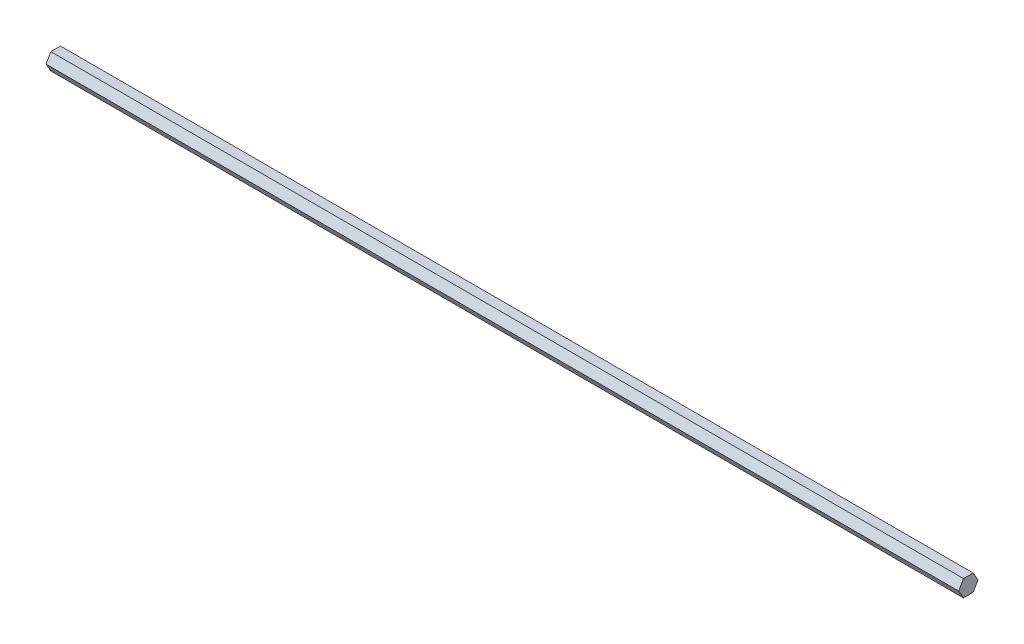
ISO-10303-21;
HEADER;
FILE_DESCRIPTION(('STEP AP214'),'2;1');
FILE_NAME('part.step','',(''),(''),'','','');
FILE_SCHEMA(('AUTOMOTIVE_DESIGN { 1 0 10303 214 1 1 1 1 }'));
ENDSEC;
DATA;
#1=APPLICATION_CONTEXT('core data for automotive mechanical design processes');
#2=APPLICATION_PROTOCOL_DEFINITION('international standard','automotive_design',2000,#1);
#3=PRODUCT_CONTEXT('',#1,'mechanical');
#4=PRODUCT('Part','Part','',(#3));
#5=PRODUCT_RELATED_PRODUCT_CATEGORY('part','',(#4));
#6=PRODUCT_DEFINITION_FORMATION('','',#4);
#7=PRODUCT_DEFINITION_CONTEXT('part definition',#1,'design');
#8=PRODUCT_DEFINITION('design','',#6,#7);
#9=PRODUCT_DEFINITION_SHAPE('','',#8);
#10=(LENGTH_UNIT() NAMED_UNIT(*) SI_UNIT(.MILLI.,.METRE.));
#11=(NAMED_UNIT(*) PLANE_ANGLE_UNIT() SI_UNIT($,.RADIAN.));
#12=(NAMED_UNIT(*) SI_UNIT($,.STERADIAN.) SOLID_ANGLE_UNIT());
#13=UNCERTAINTY_MEASURE_WITH_UNIT(LENGTH_MEASURE(1.E-05),#10,'distance_accuracy_value','');
#14=(GEOMETRIC_REPRESENTATION_CONTEXT(3) GLOBAL_UNCERTAINTY_ASSIGNED_CONTEXT((#13)) GLOBAL_UNIT_ASSIGNED_CONTEXT((#10,
#11,#12)) REPRESENTATION_CONTEXT('',''));
#15=CARTESIAN_POINT('',(0.,0.,0.));
#16=DIRECTION('',(0.,0.,1.));
#17=DIRECTION('',(1.,0.,0.));
#18=AXIS2_PLACEMENT_3D('',#15,#16,#17);
#19=CARTESIAN_POINT('',(692.15,-6.34999999999994,-3.66617420935419));
#20=DIRECTION('',(0.,0.499999999999995,0.866025403784442));
#21=DIRECTION('',(0.,-0.866025403784442,0.499999999999995));
#22=AXIS2_PLACEMENT_3D('',#19,#20,#21);
#23=PLANE('',#22);
#24=DIRECTION('',(0.,0.866025403784442,-0.499999999999995));
#25=VECTOR('',#24,1.);
#26=CARTESIAN_POINT('',(0.,-6.34999999999994,-3.66617420935419));
#27=LINE('',#26,#25);
#28=CARTESIAN_POINT('',(0.,-6.34999999999994,-3.66617420935419));
#29=VERTEX_POINT('',#28);
#30=CARTESIAN_POINT('',(0.,0.,-7.33234841870822));
#31=VERTEX_POINT('',#30);
#32=EDGE_CURVE('E116',#29,#31,#27,.T.);
#33=ORIENTED_EDGE('',*,*,#32,.T.);
#34=DIRECTION('',(-1.,0.,0.));
#35=VECTOR('',#34,1.);
#36=CARTESIAN_POINT('',(692.15,0.,-7.33234841870822));
#37=LINE('',#36,#35);
#38=CARTESIAN_POINT('',(692.15,0.,-7.33234841870822));
#39=VERTEX_POINT('',#38);
#40=EDGE_CURVE('E11',#39,#31,#37,.T.);
#41=ORIENTED_EDGE('',*,*,#40,.F.);
#42=DIRECTION('',(0.,0.866025403784442,-0.499999999999995));
#43=VECTOR('',#42,1.);
#44=CARTESIAN_POINT('',(692.15,-6.34999999999994,-3.66617420935419));
#45=LINE('',#44,#43);
#46=CARTESIAN_POINT('',(692.15,-6.34999999999994,-3.66617420935419));
#47=VERTEX_POINT('',#46);
#48=EDGE_CURVE('E126',#47,#39,#45,.T.);
#49=ORIENTED_EDGE('',*,*,#48,.F.);
#50=DIRECTION('',(-1.,0.,0.));
#51=VECTOR('',#50,1.);
#52=CARTESIAN_POINT('',(692.15,-6.34999999999994,-3.66617420935419));
#53=LINE('',#52,#51);
#54=EDGE_CURVE('E112',#47,#29,#53,.T.);
#55=ORIENTED_EDGE('',*,*,#54,.T.);
#56=EDGE_LOOP('',(#33,#41,#49,#55));
#57=FACE_BOUND('',#56,.T.);
#58=ADVANCED_FACE('F32',(#57),#23,.F.);
#59=CARTESIAN_POINT('',(692.15,0.,-7.33234841870822));
#60=DIRECTION('',(0.,-0.500000000000001,0.866025403784438));
#61=DIRECTION('',(0.,-0.866025403784438,-0.500000000000001));
#62=AXIS2_PLACEMENT_3D('',#59,#60,#61);
#63=PLANE('',#62);
#64=DIRECTION('',(0.,0.866025403784438,0.500000000000001));
#65=VECTOR('',#64,1.);
#66=CARTESIAN_POINT('',(0.,0.,-7.33234841870822));
#67=LINE('',#66,#65);
#68=CARTESIAN_POINT('',(0.,6.34999999999999,-3.6661742093541));
#69=VERTEX_POINT('',#68);
#70=EDGE_CURVE('E119',#31,#69,#67,.T.);
#71=ORIENTED_EDGE('',*,*,#70,.T.);
#72=DIRECTION('',(-1.,0.,0.));
#73=VECTOR('',#72,1.);
#74=CARTESIAN_POINT('',(692.15,6.34999999999999,-3.6661742093541));
#75=LINE('',#74,#73);
#76=CARTESIAN_POINT('',(692.15,6.34999999999999,-3.6661742093541));
#77=VERTEX_POINT('',#76);
#78=EDGE_CURVE('E40',#77,#69,#75,.T.);
#79=ORIENTED_EDGE('',*,*,#78,.F.);
#80=DIRECTION('',(0.,0.866025403784438,0.500000000000001));
#81=VECTOR('',#80,1.);
#82=CARTESIAN_POINT('',(692.15,0.,-7.33234841870822));
#83=LINE('',#82,#81);
#84=EDGE_CURVE('E85',#39,#77,#83,.T.);
#85=ORIENTED_EDGE('',*,*,#84,.F.);
#86=ORIENTED_EDGE('',*,*,#40,.T.);
#87=EDGE_LOOP('',(#71,#79,#85,#86));
#88=FACE_BOUND('',#87,.T.);
#89=ADVANCED_FACE('F150',(#88),#63,.F.);
#90=CARTESIAN_POINT('',(692.15,6.34999999999999,-3.6661742093541));
#91=DIRECTION('',(0.,-1.,0.));
#92=DIRECTION('',(0.,0.,-1.));
#93=AXIS2_PLACEMENT_3D('',#90,#91,#92);
#94=PLANE('',#93);
#95=DIRECTION('',(0.,0.,1.));
#96=VECTOR('',#95,1.);
#97=CARTESIAN_POINT('',(0.,6.34999999999999,-3.6661742093541));
#98=LINE('',#97,#96);
#99=CARTESIAN_POINT('',(0.,6.34999999999996,3.66617420935414));
#100=VERTEX_POINT('',#99);
#101=EDGE_CURVE('E121',#69,#100,#98,.T.);
#102=ORIENTED_EDGE('',*,*,#101,.T.);
#103=DIRECTION('',(-1.,0.,0.));
#104=VECTOR('',#103,1.);
#105=CARTESIAN_POINT('',(692.15,6.34999999999996,3.66617420935414));
#106=LINE('',#105,#104);
#107=CARTESIAN_POINT('',(692.15,6.34999999999996,3.66617420935414));
#108=VERTEX_POINT('',#107);
#109=EDGE_CURVE('E107',#108,#100,#106,.T.);
#110=ORIENTED_EDGE('',*,*,#109,.F.);
#111=DIRECTION('',(0.,0.,1.));
#112=VECTOR('',#111,1.);
#113=CARTESIAN_POINT('',(692.15,6.34999999999999,-3.6661742093541));
#114=LINE('',#113,#112);
#115=EDGE_CURVE('E98',#77,#108,#114,.T.);
#116=ORIENTED_EDGE('',*,*,#115,.F.);
#117=ORIENTED_EDGE('',*,*,#78,.T.);
#118=EDGE_LOOP('',(#102,#110,#116,#117));
#119=FACE_BOUND('',#118,.T.);
#120=ADVANCED_FACE('F132',(#119),#94,.F.);
#121=CARTESIAN_POINT('',(692.15,6.34999999999996,3.66617420935414));
#122=DIRECTION('',(0.,-0.499999999999995,-0.866025403784441));
#123=DIRECTION('',(0.,0.866025403784442,-0.499999999999995));
#124=AXIS2_PLACEMENT_3D('',#121,#122,#123);
#125=PLANE('',#124);
#126=DIRECTION('',(0.,-0.866025403784442,0.499999999999995));
#127=VECTOR('',#126,1.);
#128=CARTESIAN_POINT('',(0.,6.34999999999996,3.66617420935414));
#129=LINE('',#128,#127);
#130=CARTESIAN_POINT('',(0.,0.,7.33234841870822));
#131=VERTEX_POINT('',#130);
#132=EDGE_CURVE('E106',#100,#131,#129,.T.);
#133=ORIENTED_EDGE('',*,*,#132,.T.);
#134=DIRECTION('',(-1.,0.,0.));
#135=VECTOR('',#134,1.);
#136=CARTESIAN_POINT('',(692.15,0.,7.33234841870822));
#137=LINE('',#136,#135);
#138=CARTESIAN_POINT('',(692.15,0.,7.33234841870822));
#139=VERTEX_POINT('',#138);
#140=EDGE_CURVE('E103',#139,#131,#137,.T.);
#141=ORIENTED_EDGE('',*,*,#140,.F.);
#142=DIRECTION('',(0.,-0.866025403784442,0.499999999999995));
#143=VECTOR('',#142,1.);
#144=CARTESIAN_POINT('',(692.15,6.34999999999996,3.66617420935414));
#145=LINE('',#144,#143);
#146=EDGE_CURVE('E92',#108,#139,#145,.T.);
#147=ORIENTED_EDGE('',*,*,#146,.F.);
#148=ORIENTED_EDGE('',*,*,#109,.T.);
#149=EDGE_LOOP('',(#133,#141,#147,#148));
#150=FACE_BOUND('',#149,.T.);
#151=ADVANCED_FACE('F104',(#150),#125,.F.);
#152=CARTESIAN_POINT('',(692.15,0.,7.33234841870822));
#153=DIRECTION('',(0.,0.500000000000007,-0.866025403784435));
#154=DIRECTION('',(0.,0.866025403784435,0.500000000000007));
#155=AXIS2_PLACEMENT_3D('',#152,#153,#154);
#156=PLANE('',#155);
#157=DIRECTION('',(0.,-0.866025403784435,-0.500000000000007));
#158=VECTOR('',#157,1.);
#159=CARTESIAN_POINT('',(0.,0.,7.33234841870822));
#160=LINE('',#159,#158);
#161=CARTESIAN_POINT('',(0.,-6.35000000000001,3.66617420935405));
#162=VERTEX_POINT('',#161);
#163=EDGE_CURVE('E71',#131,#162,#160,.T.);
#164=ORIENTED_EDGE('',*,*,#163,.T.);
#165=DIRECTION('',(-1.,0.,0.));
#166=VECTOR('',#165,1.);
#167=CARTESIAN_POINT('',(692.15,-6.35000000000001,3.66617420935405));
#168=LINE('',#167,#166);
#169=CARTESIAN_POINT('',(692.15,-6.35000000000001,3.66617420935405));
#170=VERTEX_POINT('',#169);
#171=EDGE_CURVE('E108',#170,#162,#168,.T.);
#172=ORIENTED_EDGE('',*,*,#171,.F.);
#173=DIRECTION('',(0.,-0.866025403784435,-0.500000000000007));
#174=VECTOR('',#173,1.);
#175=CARTESIAN_POINT('',(692.15,0.,7.33234841870822));
#176=LINE('',#175,#174);
#177=EDGE_CURVE('E96',#139,#170,#176,.T.);
#178=ORIENTED_EDGE('',*,*,#177,.F.);
#179=ORIENTED_EDGE('',*,*,#140,.T.);
#180=EDGE_LOOP('',(#164,#172,#178,#179));
#181=FACE_BOUND('',#180,.T.);
#182=ADVANCED_FACE('F110',(#181),#156,.F.);
#183=CARTESIAN_POINT('',(692.15,-6.35000000000001,3.66617420935405));
#184=DIRECTION('',(0.,1.,0.));
#185=DIRECTION('',(0.,0.,1.));
#186=AXIS2_PLACEMENT_3D('',#183,#184,#185);
#187=PLANE('',#186);
#188=DIRECTION('',(0.,0.,-1.));
#189=VECTOR('',#188,1.);
#190=CARTESIAN_POINT('',(0.,-6.35000000000001,3.66617420935405));
#191=LINE('',#190,#189);
#192=EDGE_CURVE('E77',#162,#29,#191,.T.);
#193=ORIENTED_EDGE('',*,*,#192,.T.);
#194=ORIENTED_EDGE('',*,*,#54,.F.);
#195=DIRECTION('',(0.,0.,-1.));
#196=VECTOR('',#195,1.);
#197=CARTESIAN_POINT('',(692.15,-6.35000000000001,3.66617420935405));
#198=LINE('',#197,#196);
#199=EDGE_CURVE('E48',#170,#47,#198,.T.);
#200=ORIENTED_EDGE('',*,*,#199,.F.);
#201=ORIENTED_EDGE('',*,*,#171,.T.);
#202=EDGE_LOOP('',(#193,#194,#200,#201));
#203=FACE_BOUND('',#202,.T.);
#204=ADVANCED_FACE('F139',(#203),#187,.F.);
#205=CARTESIAN_POINT('',(692.15,0.,0.));
#206=DIRECTION('',(1.,0.,0.));
#207=DIRECTION('',(0.,0.,-1.));
#208=AXIS2_PLACEMENT_3D('',#205,#206,#207);
#209=PLANE('',#208);
#210=ORIENTED_EDGE('',*,*,#48,.T.);
#211=ORIENTED_EDGE('',*,*,#84,.T.);
#212=ORIENTED_EDGE('',*,*,#115,.T.);
#213=ORIENTED_EDGE('',*,*,#146,.T.);
#214=ORIENTED_EDGE('',*,*,#177,.T.);
#215=ORIENTED_EDGE('',*,*,#199,.T.);
#216=EDGE_LOOP('',(#210,#211,#212,#213,#214,#215));
#217=FACE_BOUND('',#216,.T.);
#218=ADVANCED_FACE('F94',(#217),#209,.T.);
#219=CARTESIAN_POINT('',(0.,0.,0.));
#220=DIRECTION('',(1.,0.,0.));
#221=DIRECTION('',(0.,0.,-1.));
#222=AXIS2_PLACEMENT_3D('',#219,#220,#221);
#223=PLANE('',#222);
#224=ORIENTED_EDGE('',*,*,#32,.F.);
#225=ORIENTED_EDGE('',*,*,#192,.F.);
#226=ORIENTED_EDGE('',*,*,#163,.F.);
#227=ORIENTED_EDGE('',*,*,#132,.F.);
#228=ORIENTED_EDGE('',*,*,#101,.F.);
#229=ORIENTED_EDGE('',*,*,#70,.F.);
#230=EDGE_LOOP('',(#224,#225,#226,#227,#228,#229));
#231=FACE_BOUND('',#230,.T.);
#232=ADVANCED_FACE('F135',(#231),#223,.F.);
#233=CLOSED_SHELL('',(#58,#89,#120,#151,#182,#204,#218,#232));
#234=MANIFOLD_SOLID_BREP('B2',#233);
#235=ADVANCED_BREP_SHAPE_REPRESENTATION('',(#18,#234),#14);
#236=SHAPE_DEFINITION_REPRESENTATION(#9,#235);
ENDSEC;
END-ISO-10303-21;
